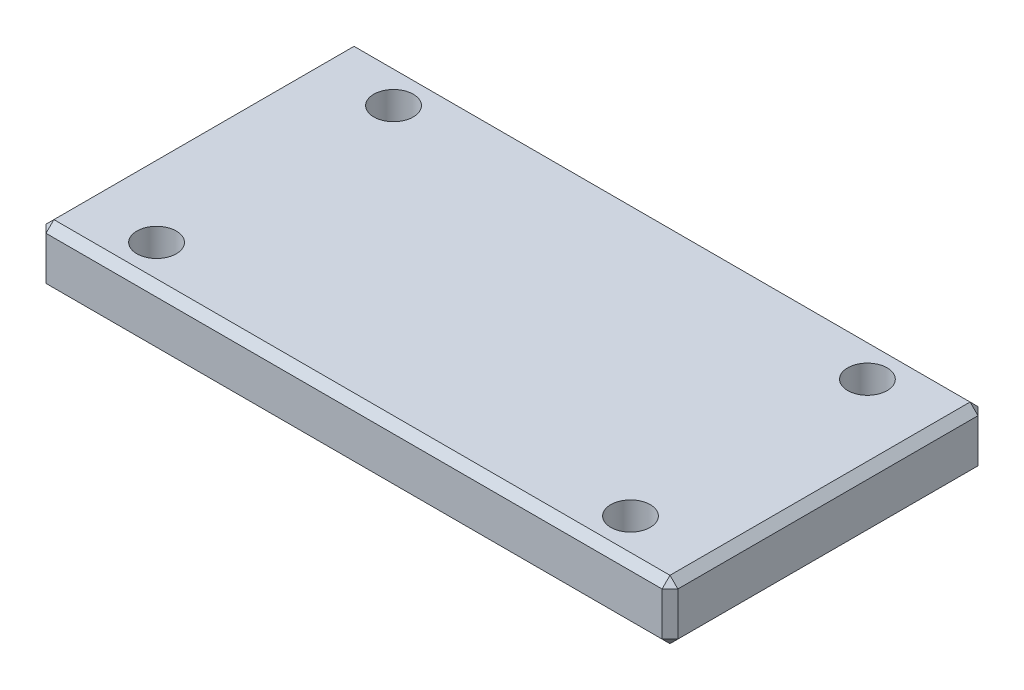
ISO-10303-21;
HEADER;
FILE_DESCRIPTION(('STEP AP214'),'2;1');
FILE_NAME('part.step','',(''),(''),'','','');
FILE_SCHEMA(('AUTOMOTIVE_DESIGN { 1 0 10303 214 1 1 1 1 }'));
ENDSEC;
DATA;
#1=APPLICATION_CONTEXT('core data for automotive mechanical design processes');
#2=APPLICATION_PROTOCOL_DEFINITION('international standard','automotive_design',2000,#1);
#3=PRODUCT_CONTEXT('',#1,'mechanical');
#4=PRODUCT('Part','Part','',(#3));
#5=PRODUCT_RELATED_PRODUCT_CATEGORY('part','',(#4));
#6=PRODUCT_DEFINITION_FORMATION('','',#4);
#7=PRODUCT_DEFINITION_CONTEXT('part definition',#1,'design');
#8=PRODUCT_DEFINITION('design','',#6,#7);
#9=PRODUCT_DEFINITION_SHAPE('','',#8);
#10=(LENGTH_UNIT() NAMED_UNIT(*) SI_UNIT(.MILLI.,.METRE.));
#11=(NAMED_UNIT(*) PLANE_ANGLE_UNIT() SI_UNIT($,.RADIAN.));
#12=(NAMED_UNIT(*) SI_UNIT($,.STERADIAN.) SOLID_ANGLE_UNIT());
#13=UNCERTAINTY_MEASURE_WITH_UNIT(LENGTH_MEASURE(1.E-05),#10,'distance_accuracy_value','');
#14=(GEOMETRIC_REPRESENTATION_CONTEXT(3) GLOBAL_UNCERTAINTY_ASSIGNED_CONTEXT((#13)) GLOBAL_UNIT_ASSIGNED_CONTEXT((#10,
#11,#12)) REPRESENTATION_CONTEXT('',''));
#15=CARTESIAN_POINT('',(0.,0.,0.));
#16=DIRECTION('',(0.,0.,1.));
#17=DIRECTION('',(1.,0.,0.));
#18=AXIS2_PLACEMENT_3D('',#15,#16,#17);
#19=CARTESIAN_POINT('',(-50.8,9.525,25.4));
#20=DIRECTION('',(1.,0.,0.));
#21=DIRECTION('',(0.,0.,-1.));
#22=AXIS2_PLACEMENT_3D('',#19,#20,#21);
#23=PLANE('',#22);
#24=DIRECTION('',(0.,-1.,0.));
#25=VECTOR('',#24,1.);
#26=CARTESIAN_POINT('',(-50.8,9.525,-24.13));
#27=LINE('',#26,#25);
#28=CARTESIAN_POINT('',(-50.8,8.25499999999998,-24.13));
#29=VERTEX_POINT('',#28);
#30=CARTESIAN_POINT('',(-50.8,1.27000000000002,-24.13));
#31=VERTEX_POINT('',#30);
#32=EDGE_CURVE('E196',#29,#31,#27,.T.);
#33=ORIENTED_EDGE('',*,*,#32,.T.);
#34=DIRECTION('',(0.,0.,1.));
#35=VECTOR('',#34,1.);
#36=CARTESIAN_POINT('',(-50.8,1.27000000000002,25.4));
#37=LINE('',#36,#35);
#38=CARTESIAN_POINT('',(-50.8,1.27000000000002,24.13));
#39=VERTEX_POINT('',#38);
#40=EDGE_CURVE('E198',#31,#39,#37,.T.);
#41=ORIENTED_EDGE('',*,*,#40,.T.);
#42=DIRECTION('',(0.,1.,0.));
#43=VECTOR('',#42,1.);
#44=CARTESIAN_POINT('',(-50.8,9.525,24.13));
#45=LINE('',#44,#43);
#46=CARTESIAN_POINT('',(-50.8,8.25499999999998,24.13));
#47=VERTEX_POINT('',#46);
#48=EDGE_CURVE('E192',#39,#47,#45,.T.);
#49=ORIENTED_EDGE('',*,*,#48,.T.);
#50=DIRECTION('',(0.,0.,-1.));
#51=VECTOR('',#50,1.);
#52=CARTESIAN_POINT('',(-50.8,8.25499999999998,-25.4));
#53=LINE('',#52,#51);
#54=EDGE_CURVE('E194',#47,#29,#53,.T.);
#55=ORIENTED_EDGE('',*,*,#54,.T.);
#56=EDGE_LOOP('',(#33,#41,#49,#55));
#57=FACE_BOUND('',#56,.T.);
#58=ADVANCED_FACE('F35',(#57),#23,.F.);
#59=CARTESIAN_POINT('',(50.8,9.525,25.4));
#60=DIRECTION('',(0.,0.,-1.));
#61=DIRECTION('',(-1.,0.,0.));
#62=AXIS2_PLACEMENT_3D('',#59,#60,#61);
#63=PLANE('',#62);
#64=DIRECTION('',(0.,-1.,0.));
#65=VECTOR('',#64,1.);
#66=CARTESIAN_POINT('',(-49.53,9.525,25.4));
#67=LINE('',#66,#65);
#68=CARTESIAN_POINT('',(-49.53,8.25499999999998,25.4));
#69=VERTEX_POINT('',#68);
#70=CARTESIAN_POINT('',(-49.53,1.27000000000002,25.4));
#71=VERTEX_POINT('',#70);
#72=EDGE_CURVE('E161',#69,#71,#67,.T.);
#73=ORIENTED_EDGE('',*,*,#72,.T.);
#74=DIRECTION('',(1.,0.,0.));
#75=VECTOR('',#74,1.);
#76=CARTESIAN_POINT('',(50.8,1.27000000000002,25.4));
#77=LINE('',#76,#75);
#78=CARTESIAN_POINT('',(49.53,1.27000000000002,25.4));
#79=VERTEX_POINT('',#78);
#80=EDGE_CURVE('E132',#71,#79,#77,.T.);
#81=ORIENTED_EDGE('',*,*,#80,.T.);
#82=DIRECTION('',(0.,1.,0.));
#83=VECTOR('',#82,1.);
#84=CARTESIAN_POINT('',(49.53,9.525,25.4));
#85=LINE('',#84,#83);
#86=CARTESIAN_POINT('',(49.53,8.25499999999998,25.4));
#87=VERTEX_POINT('',#86);
#88=EDGE_CURVE('E151',#79,#87,#85,.T.);
#89=ORIENTED_EDGE('',*,*,#88,.T.);
#90=DIRECTION('',(-1.,0.,0.));
#91=VECTOR('',#90,1.);
#92=CARTESIAN_POINT('',(-50.8,8.25499999999998,25.4));
#93=LINE('',#92,#91);
#94=EDGE_CURVE('E157',#87,#69,#93,.T.);
#95=ORIENTED_EDGE('',*,*,#94,.T.);
#96=EDGE_LOOP('',(#73,#81,#89,#95));
#97=FACE_BOUND('',#96,.T.);
#98=ADVANCED_FACE('F159',(#97),#63,.F.);
#99=CARTESIAN_POINT('',(50.8,9.525,25.4));
#100=DIRECTION('',(-1.,0.,0.));
#101=DIRECTION('',(0.,0.,1.));
#102=AXIS2_PLACEMENT_3D('',#99,#100,#101);
#103=PLANE('',#102);
#104=DIRECTION('',(0.,-1.,0.));
#105=VECTOR('',#104,1.);
#106=CARTESIAN_POINT('',(50.8,9.525,24.13));
#107=LINE('',#106,#105);
#108=CARTESIAN_POINT('',(50.8,8.25499999999998,24.13));
#109=VERTEX_POINT('',#108);
#110=CARTESIAN_POINT('',(50.8,1.27000000000002,24.13));
#111=VERTEX_POINT('',#110);
#112=EDGE_CURVE('E174',#109,#111,#107,.T.);
#113=ORIENTED_EDGE('',*,*,#112,.T.);
#114=DIRECTION('',(0.,0.,-1.));
#115=VECTOR('',#114,1.);
#116=CARTESIAN_POINT('',(50.8,1.27000000000002,25.4));
#117=LINE('',#116,#115);
#118=CARTESIAN_POINT('',(50.8,1.27000000000002,-24.13));
#119=VERTEX_POINT('',#118);
#120=EDGE_CURVE('E180',#111,#119,#117,.T.);
#121=ORIENTED_EDGE('',*,*,#120,.T.);
#122=DIRECTION('',(0.,1.,0.));
#123=VECTOR('',#122,1.);
#124=CARTESIAN_POINT('',(50.8,9.525,-24.13));
#125=LINE('',#124,#123);
#126=CARTESIAN_POINT('',(50.8,8.25499999999998,-24.13));
#127=VERTEX_POINT('',#126);
#128=EDGE_CURVE('E178',#119,#127,#125,.T.);
#129=ORIENTED_EDGE('',*,*,#128,.T.);
#130=DIRECTION('',(0.,0.,1.));
#131=VECTOR('',#130,1.);
#132=CARTESIAN_POINT('',(50.8,8.25499999999998,25.4));
#133=LINE('',#132,#131);
#134=EDGE_CURVE('E176',#127,#109,#133,.T.);
#135=ORIENTED_EDGE('',*,*,#134,.T.);
#136=EDGE_LOOP('',(#113,#121,#129,#135));
#137=FACE_BOUND('',#136,.T.);
#138=ADVANCED_FACE('F295',(#137),#103,.F.);
#139=CARTESIAN_POINT('',(50.8,9.525,-25.4));
#140=DIRECTION('',(0.,0.,1.));
#141=DIRECTION('',(1.,0.,0.));
#142=AXIS2_PLACEMENT_3D('',#139,#140,#141);
#143=PLANE('',#142);
#144=DIRECTION('',(1.,0.,0.));
#145=VECTOR('',#144,1.);
#146=CARTESIAN_POINT('',(50.8,8.25499999999998,-25.4));
#147=LINE('',#146,#145);
#148=CARTESIAN_POINT('',(-49.53,8.25499999999998,-25.4));
#149=VERTEX_POINT('',#148);
#150=CARTESIAN_POINT('',(49.53,8.25499999999998,-25.4));
#151=VERTEX_POINT('',#150);
#152=EDGE_CURVE('E185',#149,#151,#147,.T.);
#153=ORIENTED_EDGE('',*,*,#152,.T.);
#154=DIRECTION('',(0.,-1.,0.));
#155=VECTOR('',#154,1.);
#156=CARTESIAN_POINT('',(49.53,9.525,-25.4));
#157=LINE('',#156,#155);
#158=CARTESIAN_POINT('',(49.53,1.27000000000002,-25.4));
#159=VERTEX_POINT('',#158);
#160=EDGE_CURVE('E190',#151,#159,#157,.T.);
#161=ORIENTED_EDGE('',*,*,#160,.T.);
#162=DIRECTION('',(-1.,0.,0.));
#163=VECTOR('',#162,1.);
#164=CARTESIAN_POINT('',(50.8,1.27000000000002,-25.4));
#165=LINE('',#164,#163);
#166=CARTESIAN_POINT('',(-49.53,1.27000000000002,-25.4));
#167=VERTEX_POINT('',#166);
#168=EDGE_CURVE('E187',#159,#167,#165,.T.);
#169=ORIENTED_EDGE('',*,*,#168,.T.);
#170=DIRECTION('',(0.,1.,0.));
#171=VECTOR('',#170,1.);
#172=CARTESIAN_POINT('',(-49.53,9.525,-25.4));
#173=LINE('',#172,#171);
#174=EDGE_CURVE('E183',#167,#149,#173,.T.);
#175=ORIENTED_EDGE('',*,*,#174,.T.);
#176=EDGE_LOOP('',(#153,#161,#169,#175));
#177=FACE_BOUND('',#176,.T.);
#178=ADVANCED_FACE('F422',(#177),#143,.F.);
#179=CARTESIAN_POINT('',(0.,9.525,0.));
#180=DIRECTION('',(0.,1.,0.));
#181=DIRECTION('',(0.,0.,1.));
#182=AXIS2_PLACEMENT_3D('',#179,#180,#181);
#183=PLANE('',#182);
#184=CARTESIAN_POINT('',(38.1,9.525,-19.05));
#185=DIRECTION('',(0.,1.,0.));
#186=DIRECTION('',(0.,0.,-1.));
#187=AXIS2_PLACEMENT_3D('',#184,#185,#186);
#188=CIRCLE('',#187,3.175);
#189=CARTESIAN_POINT('',(38.1,9.525,-15.875));
#190=VERTEX_POINT('',#189);
#191=EDGE_CURVE('E455',#190,#190,#188,.T.);
#192=ORIENTED_EDGE('',*,*,#191,.F.);
#193=EDGE_LOOP('',(#192));
#194=FACE_BOUND('',#193,.T.);
#195=CARTESIAN_POINT('',(38.1,9.525,19.05));
#196=DIRECTION('',(0.,1.,0.));
#197=DIRECTION('',(0.,0.,1.));
#198=AXIS2_PLACEMENT_3D('',#195,#196,#197);
#199=CIRCLE('',#198,3.175);
#200=CARTESIAN_POINT('',(38.1,9.525,22.225));
#201=VERTEX_POINT('',#200);
#202=EDGE_CURVE('E460',#201,#201,#199,.T.);
#203=ORIENTED_EDGE('',*,*,#202,.F.);
#204=EDGE_LOOP('',(#203));
#205=FACE_BOUND('',#204,.T.);
#206=CARTESIAN_POINT('',(-38.1,9.525,19.05));
#207=DIRECTION('',(0.,1.,0.));
#208=DIRECTION('',(0.,0.,-1.));
#209=AXIS2_PLACEMENT_3D('',#206,#207,#208);
#210=CIRCLE('',#209,3.175);
#211=CARTESIAN_POINT('',(-38.1,9.525,22.225));
#212=VERTEX_POINT('',#211);
#213=EDGE_CURVE('E466',#212,#212,#210,.T.);
#214=ORIENTED_EDGE('',*,*,#213,.F.);
#215=EDGE_LOOP('',(#214));
#216=FACE_BOUND('',#215,.T.);
#217=CARTESIAN_POINT('',(-38.1,9.525,-19.05));
#218=DIRECTION('',(0.,1.,0.));
#219=DIRECTION('',(0.,0.,1.));
#220=AXIS2_PLACEMENT_3D('',#217,#218,#219);
#221=CIRCLE('',#220,3.175);
#222=CARTESIAN_POINT('',(-38.1,9.525,-15.875));
#223=VERTEX_POINT('',#222);
#224=EDGE_CURVE('E449',#223,#223,#221,.T.);
#225=ORIENTED_EDGE('',*,*,#224,.F.);
#226=EDGE_LOOP('',(#225));
#227=FACE_BOUND('',#226,.T.);
#228=DIRECTION('',(0.,0.,-1.));
#229=VECTOR('',#228,1.);
#230=CARTESIAN_POINT('',(49.53,9.525,-25.4));
#231=LINE('',#230,#229);
#232=CARTESIAN_POINT('',(49.53,9.525,24.13));
#233=VERTEX_POINT('',#232);
#234=CARTESIAN_POINT('',(49.53,9.525,-24.13));
#235=VERTEX_POINT('',#234);
#236=EDGE_CURVE('E45',#233,#235,#231,.T.);
#237=ORIENTED_EDGE('',*,*,#236,.T.);
#238=DIRECTION('',(-1.,0.,0.));
#239=VECTOR('',#238,1.);
#240=CARTESIAN_POINT('',(-50.8,9.525,-24.13));
#241=LINE('',#240,#239);
#242=CARTESIAN_POINT('',(-49.53,9.525,-24.13));
#243=VERTEX_POINT('',#242);
#244=EDGE_CURVE('E11',#235,#243,#241,.T.);
#245=ORIENTED_EDGE('',*,*,#244,.T.);
#246=DIRECTION('',(0.,0.,1.));
#247=VECTOR('',#246,1.);
#248=CARTESIAN_POINT('',(-49.53,9.525,25.4));
#249=LINE('',#248,#247);
#250=CARTESIAN_POINT('',(-49.53,9.525,24.13));
#251=VERTEX_POINT('',#250);
#252=EDGE_CURVE('E59',#243,#251,#249,.T.);
#253=ORIENTED_EDGE('',*,*,#252,.T.);
#254=DIRECTION('',(1.,0.,0.));
#255=VECTOR('',#254,1.);
#256=CARTESIAN_POINT('',(50.8,9.525,24.13));
#257=LINE('',#256,#255);
#258=EDGE_CURVE('E201',#251,#233,#257,.T.);
#259=ORIENTED_EDGE('',*,*,#258,.T.);
#260=EDGE_LOOP('',(#237,#245,#253,#259));
#261=FACE_BOUND('',#260,.T.);
#262=ADVANCED_FACE('F416',(#194,#205,#216,#227,#261),#183,.T.);
#263=CARTESIAN_POINT('',(0.,0.,0.));
#264=DIRECTION('',(0.,1.,0.));
#265=DIRECTION('',(0.,0.,1.));
#266=AXIS2_PLACEMENT_3D('',#263,#264,#265);
#267=PLANE('',#266);
#268=CARTESIAN_POINT('',(38.1,0.,-19.05));
#269=DIRECTION('',(0.,1.,0.));
#270=DIRECTION('',(0.,0.,-1.));
#271=AXIS2_PLACEMENT_3D('',#268,#269,#270);
#272=CIRCLE('',#271,3.175);
#273=CARTESIAN_POINT('',(38.1,0.,-15.875));
#274=VERTEX_POINT('',#273);
#275=EDGE_CURVE('E458',#274,#274,#272,.T.);
#276=ORIENTED_EDGE('',*,*,#275,.T.);
#277=EDGE_LOOP('',(#276));
#278=FACE_BOUND('',#277,.T.);
#279=CARTESIAN_POINT('',(38.1,0.,19.05));
#280=DIRECTION('',(0.,1.,0.));
#281=DIRECTION('',(0.,0.,1.));
#282=AXIS2_PLACEMENT_3D('',#279,#280,#281);
#283=CIRCLE('',#282,3.175);
#284=CARTESIAN_POINT('',(38.1,0.,22.225));
#285=VERTEX_POINT('',#284);
#286=EDGE_CURVE('E463',#285,#285,#283,.T.);
#287=ORIENTED_EDGE('',*,*,#286,.T.);
#288=EDGE_LOOP('',(#287));
#289=FACE_BOUND('',#288,.T.);
#290=CARTESIAN_POINT('',(-38.1,0.,19.05));
#291=DIRECTION('',(0.,1.,0.));
#292=DIRECTION('',(0.,0.,-1.));
#293=AXIS2_PLACEMENT_3D('',#290,#291,#292);
#294=CIRCLE('',#293,3.175);
#295=CARTESIAN_POINT('',(-38.1,0.,22.225));
#296=VERTEX_POINT('',#295);
#297=EDGE_CURVE('E452',#296,#296,#294,.T.);
#298=ORIENTED_EDGE('',*,*,#297,.T.);
#299=EDGE_LOOP('',(#298));
#300=FACE_BOUND('',#299,.T.);
#301=CARTESIAN_POINT('',(-38.1,0.,-19.05));
#302=DIRECTION('',(0.,1.,0.));
#303=DIRECTION('',(0.,0.,1.));
#304=AXIS2_PLACEMENT_3D('',#301,#302,#303);
#305=CIRCLE('',#304,3.175);
#306=CARTESIAN_POINT('',(-38.1,0.,-15.875));
#307=VERTEX_POINT('',#306);
#308=EDGE_CURVE('E138',#307,#307,#305,.T.);
#309=ORIENTED_EDGE('',*,*,#308,.T.);
#310=EDGE_LOOP('',(#309));
#311=FACE_BOUND('',#310,.T.);
#312=DIRECTION('',(0.,0.,1.));
#313=VECTOR('',#312,1.);
#314=CARTESIAN_POINT('',(49.53,0.,0.));
#315=LINE('',#314,#313);
#316=CARTESIAN_POINT('',(49.53,0.,-24.13));
#317=VERTEX_POINT('',#316);
#318=CARTESIAN_POINT('',(49.53,0.,24.13));
#319=VERTEX_POINT('',#318);
#320=EDGE_CURVE('E171',#317,#319,#315,.T.);
#321=ORIENTED_EDGE('',*,*,#320,.T.);
#322=DIRECTION('',(-1.,0.,0.));
#323=VECTOR('',#322,1.);
#324=CARTESIAN_POINT('',(0.,0.,24.13));
#325=LINE('',#324,#323);
#326=CARTESIAN_POINT('',(-49.53,0.,24.13));
#327=VERTEX_POINT('',#326);
#328=EDGE_CURVE('E134',#319,#327,#325,.T.);
#329=ORIENTED_EDGE('',*,*,#328,.T.);
#330=DIRECTION('',(0.,0.,-1.));
#331=VECTOR('',#330,1.);
#332=CARTESIAN_POINT('',(-49.53,0.,0.));
#333=LINE('',#332,#331);
#334=CARTESIAN_POINT('',(-49.53,0.,-24.13));
#335=VERTEX_POINT('',#334);
#336=EDGE_CURVE('E163',#327,#335,#333,.T.);
#337=ORIENTED_EDGE('',*,*,#336,.T.);
#338=DIRECTION('',(1.,0.,0.));
#339=VECTOR('',#338,1.);
#340=CARTESIAN_POINT('',(0.,0.,-24.13));
#341=LINE('',#340,#339);
#342=EDGE_CURVE('E165',#335,#317,#341,.T.);
#343=ORIENTED_EDGE('',*,*,#342,.T.);
#344=EDGE_LOOP('',(#321,#329,#337,#343));
#345=FACE_BOUND('',#344,.T.);
#346=ADVANCED_FACE('F412',(#278,#289,#300,#311,#345),#267,.F.);
#347=CARTESIAN_POINT('',(0.,9.525,-24.13));
#348=DIRECTION('',(0.,0.707106781186546,-0.707106781186549));
#349=DIRECTION('',(1.,0.,0.));
#350=AXIS2_PLACEMENT_3D('',#347,#348,#349);
#351=PLANE('',#350);
#352=DIRECTION('',(0.,-0.707106781186549,-0.707106781186546));
#353=VECTOR('',#352,1.);
#354=CARTESIAN_POINT('',(-49.53,9.525,-24.13));
#355=LINE('',#354,#353);
#356=EDGE_CURVE('E40',#243,#149,#355,.T.);
#357=ORIENTED_EDGE('',*,*,#356,.F.);
#358=ORIENTED_EDGE('',*,*,#244,.F.);
#359=DIRECTION('',(0.,0.707106781186549,0.707106781186546));
#360=VECTOR('',#359,1.);
#361=CARTESIAN_POINT('',(49.53,8.25499999999998,-25.4));
#362=LINE('',#361,#360);
#363=EDGE_CURVE('E253',#151,#235,#362,.T.);
#364=ORIENTED_EDGE('',*,*,#363,.F.);
#365=ORIENTED_EDGE('',*,*,#152,.F.);
#366=EDGE_LOOP('',(#357,#358,#364,#365));
#367=FACE_BOUND('',#366,.T.);
#368=ADVANCED_FACE('F38',(#367),#351,.T.);
#369=CARTESIAN_POINT('',(-49.53,9.525,-24.13));
#370=DIRECTION('',(-0.577350269189626,0.577350269189625,-0.577350269189626));
#371=DIRECTION('',(-0.707106781186547,0.,0.707106781186547));
#372=AXIS2_PLACEMENT_3D('',#369,#370,#371);
#373=PLANE('',#372);
#374=DIRECTION('',(0.707106781186548,0.707106781186548,0.));
#375=VECTOR('',#374,1.);
#376=CARTESIAN_POINT('',(-49.53,9.525,-24.13));
#377=LINE('',#376,#375);
#378=EDGE_CURVE('E249',#243,#29,#377,.F.);
#379=ORIENTED_EDGE('',*,*,#378,.F.);
#380=ORIENTED_EDGE('',*,*,#356,.T.);
#381=DIRECTION('',(0.707106781186548,0.,-0.707106781186548));
#382=VECTOR('',#381,1.);
#383=CARTESIAN_POINT('',(-50.165,8.25499999999998,-24.765));
#384=LINE('',#383,#382);
#385=EDGE_CURVE('E251',#29,#149,#384,.T.);
#386=ORIENTED_EDGE('',*,*,#385,.F.);
#387=EDGE_LOOP('',(#379,#380,#386));
#388=FACE_BOUND('',#387,.T.);
#389=ADVANCED_FACE('F263',(#388),#373,.T.);
#390=CARTESIAN_POINT('',(49.53,8.25499999999998,-25.4));
#391=DIRECTION('',(0.577350269189626,0.577350269189625,-0.577350269189626));
#392=DIRECTION('',(-0.707106781186547,0.,-0.707106781186547));
#393=AXIS2_PLACEMENT_3D('',#390,#391,#392);
#394=PLANE('',#393);
#395=DIRECTION('',(0.707106781186548,0.,0.707106781186548));
#396=VECTOR('',#395,1.);
#397=CARTESIAN_POINT('',(49.53,8.25499999999998,-25.4));
#398=LINE('',#397,#396);
#399=EDGE_CURVE('E243',#151,#127,#398,.T.);
#400=ORIENTED_EDGE('',*,*,#399,.F.);
#401=ORIENTED_EDGE('',*,*,#363,.T.);
#402=DIRECTION('',(0.707106781186548,-0.707106781186548,0.));
#403=VECTOR('',#402,1.);
#404=CARTESIAN_POINT('',(50.165,8.88999999999999,-24.13));
#405=LINE('',#404,#403);
#406=EDGE_CURVE('E246',#127,#235,#405,.F.);
#407=ORIENTED_EDGE('',*,*,#406,.F.);
#408=EDGE_LOOP('',(#400,#401,#407));
#409=FACE_BOUND('',#408,.T.);
#410=ADVANCED_FACE('F287',(#409),#394,.T.);
#411=CARTESIAN_POINT('',(-50.8,9.525,-24.13));
#412=DIRECTION('',(0.707106781186548,0.,0.707106781186548));
#413=DIRECTION('',(0.,-1.,0.));
#414=AXIS2_PLACEMENT_3D('',#411,#412,#413);
#415=PLANE('',#414);
#416=ORIENTED_EDGE('',*,*,#385,.T.);
#417=ORIENTED_EDGE('',*,*,#174,.F.);
#418=DIRECTION('',(-0.707106781186548,0.,0.707106781186548));
#419=VECTOR('',#418,1.);
#420=CARTESIAN_POINT('',(-49.53,1.27000000000002,-25.4));
#421=LINE('',#420,#419);
#422=EDGE_CURVE('E238',#31,#167,#421,.F.);
#423=ORIENTED_EDGE('',*,*,#422,.F.);
#424=ORIENTED_EDGE('',*,*,#32,.F.);
#425=EDGE_LOOP('',(#416,#417,#423,#424));
#426=FACE_BOUND('',#425,.T.);
#427=ADVANCED_FACE('F269',(#426),#415,.F.);
#428=CARTESIAN_POINT('',(-49.53,9.525,0.));
#429=DIRECTION('',(-0.707106781186548,0.707106781186548,0.));
#430=DIRECTION('',(0.,0.,-1.));
#431=AXIS2_PLACEMENT_3D('',#428,#429,#430);
#432=PLANE('',#431);
#433=ORIENTED_EDGE('',*,*,#378,.T.);
#434=ORIENTED_EDGE('',*,*,#54,.F.);
#435=DIRECTION('',(-0.707106781186548,-0.707106781186548,0.));
#436=VECTOR('',#435,1.);
#437=CARTESIAN_POINT('',(-49.53,9.525,24.13));
#438=LINE('',#437,#436);
#439=EDGE_CURVE('E235',#251,#47,#438,.T.);
#440=ORIENTED_EDGE('',*,*,#439,.F.);
#441=ORIENTED_EDGE('',*,*,#252,.F.);
#442=EDGE_LOOP('',(#433,#434,#440,#441));
#443=FACE_BOUND('',#442,.T.);
#444=ADVANCED_FACE('F276',(#443),#432,.T.);
#445=CARTESIAN_POINT('',(0.,9.525,24.13));
#446=DIRECTION('',(0.,0.707106781186548,0.707106781186547));
#447=DIRECTION('',(-1.,0.,0.));
#448=AXIS2_PLACEMENT_3D('',#445,#446,#447);
#449=PLANE('',#448);
#450=DIRECTION('',(0.,-0.707106781186547,0.707106781186548));
#451=VECTOR('',#450,1.);
#452=CARTESIAN_POINT('',(49.53,8.88999999999999,24.765));
#453=LINE('',#452,#451);
#454=EDGE_CURVE('E229',#233,#87,#453,.T.);
#455=ORIENTED_EDGE('',*,*,#454,.F.);
#456=ORIENTED_EDGE('',*,*,#258,.F.);
#457=DIRECTION('',(0.,0.707106781186547,-0.707106781186548));
#458=VECTOR('',#457,1.);
#459=CARTESIAN_POINT('',(-49.53,9.525,24.13));
#460=LINE('',#459,#458);
#461=EDGE_CURVE('E232',#69,#251,#460,.T.);
#462=ORIENTED_EDGE('',*,*,#461,.F.);
#463=ORIENTED_EDGE('',*,*,#94,.F.);
#464=EDGE_LOOP('',(#455,#456,#462,#463));
#465=FACE_BOUND('',#464,.T.);
#466=ADVANCED_FACE('F278',(#465),#449,.T.);
#467=CARTESIAN_POINT('',(49.53,9.525,0.));
#468=DIRECTION('',(0.707106781186548,0.707106781186548,0.));
#469=DIRECTION('',(0.,0.,1.));
#470=AXIS2_PLACEMENT_3D('',#467,#468,#469);
#471=PLANE('',#470);
#472=ORIENTED_EDGE('',*,*,#406,.T.);
#473=ORIENTED_EDGE('',*,*,#236,.F.);
#474=DIRECTION('',(-0.707106781186548,0.707106781186548,0.));
#475=VECTOR('',#474,1.);
#476=CARTESIAN_POINT('',(50.8,8.25499999999998,24.13));
#477=LINE('',#476,#475);
#478=EDGE_CURVE('E226',#109,#233,#477,.T.);
#479=ORIENTED_EDGE('',*,*,#478,.F.);
#480=ORIENTED_EDGE('',*,*,#134,.F.);
#481=EDGE_LOOP('',(#472,#473,#479,#480));
#482=FACE_BOUND('',#481,.T.);
#483=ADVANCED_FACE('F284',(#482),#471,.T.);
#484=CARTESIAN_POINT('',(49.53,9.525,-25.4));
#485=DIRECTION('',(-0.707106781186548,0.,0.707106781186548));
#486=DIRECTION('',(0.,-1.,0.));
#487=AXIS2_PLACEMENT_3D('',#484,#485,#486);
#488=PLANE('',#487);
#489=ORIENTED_EDGE('',*,*,#399,.T.);
#490=ORIENTED_EDGE('',*,*,#128,.F.);
#491=DIRECTION('',(-0.707106781186548,0.,-0.707106781186548));
#492=VECTOR('',#491,1.);
#493=CARTESIAN_POINT('',(50.8,1.27000000000002,-24.13));
#494=LINE('',#493,#492);
#495=EDGE_CURVE('E223',#159,#119,#494,.F.);
#496=ORIENTED_EDGE('',*,*,#495,.F.);
#497=ORIENTED_EDGE('',*,*,#160,.F.);
#498=EDGE_LOOP('',(#489,#490,#496,#497));
#499=FACE_BOUND('',#498,.T.);
#500=ADVANCED_FACE('F378',(#499),#488,.F.);
#501=CARTESIAN_POINT('',(50.8,1.27000000000002,-25.4));
#502=DIRECTION('',(0.,0.707106781186546,0.707106781186549));
#503=DIRECTION('',(-1.,0.,0.));
#504=AXIS2_PLACEMENT_3D('',#501,#502,#503);
#505=PLANE('',#504);
#506=DIRECTION('',(0.,0.707106781186549,-0.707106781186546));
#507=VECTOR('',#506,1.);
#508=CARTESIAN_POINT('',(-49.53,1.27000000000002,-25.4));
#509=LINE('',#508,#507);
#510=EDGE_CURVE('E240',#167,#335,#509,.F.);
#511=ORIENTED_EDGE('',*,*,#510,.F.);
#512=ORIENTED_EDGE('',*,*,#168,.F.);
#513=DIRECTION('',(0.,-0.707106781186549,0.707106781186546));
#514=VECTOR('',#513,1.);
#515=CARTESIAN_POINT('',(49.53,0.635000000000011,-24.765));
#516=LINE('',#515,#514);
#517=EDGE_CURVE('E220',#317,#159,#516,.F.);
#518=ORIENTED_EDGE('',*,*,#517,.F.);
#519=ORIENTED_EDGE('',*,*,#342,.F.);
#520=EDGE_LOOP('',(#511,#512,#518,#519));
#521=FACE_BOUND('',#520,.T.);
#522=ADVANCED_FACE('F371',(#521),#505,.F.);
#523=CARTESIAN_POINT('',(-49.53,1.27000000000002,-25.4));
#524=DIRECTION('',(-0.577350269189626,-0.577350269189625,-0.577350269189626));
#525=DIRECTION('',(-0.707106781186547,0.,0.707106781186547));
#526=AXIS2_PLACEMENT_3D('',#523,#524,#525);
#527=PLANE('',#526);
#528=ORIENTED_EDGE('',*,*,#422,.T.);
#529=ORIENTED_EDGE('',*,*,#510,.T.);
#530=DIRECTION('',(0.707106781186548,-0.707106781186548,0.));
#531=VECTOR('',#530,1.);
#532=CARTESIAN_POINT('',(-50.165,0.635000000000009,-24.13));
#533=LINE('',#532,#531);
#534=EDGE_CURVE('E217',#31,#335,#533,.T.);
#535=ORIENTED_EDGE('',*,*,#534,.F.);
#536=EDGE_LOOP('',(#528,#529,#535));
#537=FACE_BOUND('',#536,.T.);
#538=ADVANCED_FACE('F364',(#537),#527,.T.);
#539=CARTESIAN_POINT('',(-49.53,9.525,24.13));
#540=DIRECTION('',(-0.577350269189625,0.577350269189627,0.577350269189625));
#541=DIRECTION('',(0.,-0.707106781186546,0.707106781186549));
#542=AXIS2_PLACEMENT_3D('',#539,#540,#541);
#543=PLANE('',#542);
#544=ORIENTED_EDGE('',*,*,#461,.T.);
#545=ORIENTED_EDGE('',*,*,#439,.T.);
#546=DIRECTION('',(-0.707106781186548,0.,-0.707106781186548));
#547=VECTOR('',#546,1.);
#548=CARTESIAN_POINT('',(-50.165,8.25499999999998,24.765));
#549=LINE('',#548,#547);
#550=EDGE_CURVE('E214',#69,#47,#549,.T.);
#551=ORIENTED_EDGE('',*,*,#550,.F.);
#552=EDGE_LOOP('',(#544,#545,#551));
#553=FACE_BOUND('',#552,.T.);
#554=ADVANCED_FACE('F357',(#553),#543,.T.);
#555=CARTESIAN_POINT('',(50.8,8.25499999999998,24.13));
#556=DIRECTION('',(0.577350269189625,0.577350269189627,0.577350269189625));
#557=DIRECTION('',(0.,-0.707106781186546,0.707106781186549));
#558=AXIS2_PLACEMENT_3D('',#555,#556,#557);
#559=PLANE('',#558);
#560=ORIENTED_EDGE('',*,*,#478,.T.);
#561=ORIENTED_EDGE('',*,*,#454,.T.);
#562=DIRECTION('',(-0.707106781186548,0.,0.707106781186548));
#563=VECTOR('',#562,1.);
#564=CARTESIAN_POINT('',(50.8,8.25499999999998,24.13));
#565=LINE('',#564,#563);
#566=EDGE_CURVE('E154',#109,#87,#565,.T.);
#567=ORIENTED_EDGE('',*,*,#566,.F.);
#568=EDGE_LOOP('',(#560,#561,#567));
#569=FACE_BOUND('',#568,.T.);
#570=ADVANCED_FACE('F350',(#569),#559,.T.);
#571=CARTESIAN_POINT('',(50.8,1.27000000000002,-24.13));
#572=DIRECTION('',(0.577350269189626,-0.577350269189625,-0.577350269189626));
#573=DIRECTION('',(-0.707106781186547,0.,-0.707106781186547));
#574=AXIS2_PLACEMENT_3D('',#571,#572,#573);
#575=PLANE('',#574);
#576=ORIENTED_EDGE('',*,*,#517,.T.);
#577=ORIENTED_EDGE('',*,*,#495,.T.);
#578=DIRECTION('',(0.707106781186548,0.707106781186548,0.));
#579=VECTOR('',#578,1.);
#580=CARTESIAN_POINT('',(50.8,1.27000000000002,-24.13));
#581=LINE('',#580,#579);
#582=EDGE_CURVE('E211',#317,#119,#581,.T.);
#583=ORIENTED_EDGE('',*,*,#582,.F.);
#584=EDGE_LOOP('',(#576,#577,#583));
#585=FACE_BOUND('',#584,.T.);
#586=ADVANCED_FACE('F343',(#585),#575,.T.);
#587=CARTESIAN_POINT('',(-50.8,1.27000000000002,25.4));
#588=DIRECTION('',(0.707106781186548,0.707106781186548,0.));
#589=DIRECTION('',(0.,0.,1.));
#590=AXIS2_PLACEMENT_3D('',#587,#588,#589);
#591=PLANE('',#590);
#592=ORIENTED_EDGE('',*,*,#534,.T.);
#593=ORIENTED_EDGE('',*,*,#336,.F.);
#594=DIRECTION('',(-0.707106781186548,0.707106781186548,0.));
#595=VECTOR('',#594,1.);
#596=CARTESIAN_POINT('',(-49.53,0.,24.13));
#597=LINE('',#596,#595);
#598=EDGE_CURVE('E208',#39,#327,#597,.F.);
#599=ORIENTED_EDGE('',*,*,#598,.F.);
#600=ORIENTED_EDGE('',*,*,#40,.F.);
#601=EDGE_LOOP('',(#592,#593,#599,#600));
#602=FACE_BOUND('',#601,.T.);
#603=ADVANCED_FACE('F336',(#602),#591,.F.);
#604=CARTESIAN_POINT('',(-49.53,9.525,25.4));
#605=DIRECTION('',(0.707106781186548,0.,-0.707106781186548));
#606=DIRECTION('',(0.,-1.,0.));
#607=AXIS2_PLACEMENT_3D('',#604,#605,#606);
#608=PLANE('',#607);
#609=ORIENTED_EDGE('',*,*,#550,.T.);
#610=ORIENTED_EDGE('',*,*,#48,.F.);
#611=DIRECTION('',(0.707106781186548,0.,0.707106781186548));
#612=VECTOR('',#611,1.);
#613=CARTESIAN_POINT('',(-50.165,1.27000000000002,24.765));
#614=LINE('',#613,#612);
#615=EDGE_CURVE('E148',#71,#39,#614,.F.);
#616=ORIENTED_EDGE('',*,*,#615,.F.);
#617=ORIENTED_EDGE('',*,*,#72,.F.);
#618=EDGE_LOOP('',(#609,#610,#616,#617));
#619=FACE_BOUND('',#618,.T.);
#620=ADVANCED_FACE('F330',(#619),#608,.F.);
#621=CARTESIAN_POINT('',(50.8,9.525,24.13));
#622=DIRECTION('',(-0.707106781186548,0.,-0.707106781186548));
#623=DIRECTION('',(0.,-1.,0.));
#624=AXIS2_PLACEMENT_3D('',#621,#622,#623);
#625=PLANE('',#624);
#626=ORIENTED_EDGE('',*,*,#566,.T.);
#627=ORIENTED_EDGE('',*,*,#88,.F.);
#628=DIRECTION('',(0.707106781186548,0.,-0.707106781186548));
#629=VECTOR('',#628,1.);
#630=CARTESIAN_POINT('',(49.53,1.27000000000002,25.4));
#631=LINE('',#630,#629);
#632=EDGE_CURVE('E141',#111,#79,#631,.F.);
#633=ORIENTED_EDGE('',*,*,#632,.F.);
#634=ORIENTED_EDGE('',*,*,#112,.F.);
#635=EDGE_LOOP('',(#626,#627,#633,#634));
#636=FACE_BOUND('',#635,.T.);
#637=ADVANCED_FACE('F152',(#636),#625,.F.);
#638=CARTESIAN_POINT('',(50.8,1.27000000000002,25.4));
#639=DIRECTION('',(-0.707106781186548,0.707106781186548,0.));
#640=DIRECTION('',(0.,0.,-1.));
#641=AXIS2_PLACEMENT_3D('',#638,#639,#640);
#642=PLANE('',#641);
#643=ORIENTED_EDGE('',*,*,#582,.T.);
#644=ORIENTED_EDGE('',*,*,#120,.F.);
#645=DIRECTION('',(-0.707106781186548,-0.707106781186548,0.));
#646=VECTOR('',#645,1.);
#647=CARTESIAN_POINT('',(50.165,0.635000000000012,24.13));
#648=LINE('',#647,#646);
#649=EDGE_CURVE('E145',#319,#111,#648,.F.);
#650=ORIENTED_EDGE('',*,*,#649,.F.);
#651=ORIENTED_EDGE('',*,*,#320,.F.);
#652=EDGE_LOOP('',(#643,#644,#650,#651));
#653=FACE_BOUND('',#652,.T.);
#654=ADVANCED_FACE('F317',(#653),#642,.F.);
#655=CARTESIAN_POINT('',(-49.53,0.,24.13));
#656=DIRECTION('',(-0.577350269189625,-0.577350269189627,0.577350269189625));
#657=DIRECTION('',(0.,-0.707106781186546,-0.707106781186549));
#658=AXIS2_PLACEMENT_3D('',#655,#656,#657);
#659=PLANE('',#658);
#660=ORIENTED_EDGE('',*,*,#615,.T.);
#661=ORIENTED_EDGE('',*,*,#598,.T.);
#662=DIRECTION('',(0.,-0.707106781186547,-0.707106781186548));
#663=VECTOR('',#662,1.);
#664=CARTESIAN_POINT('',(-49.53,0.,24.13));
#665=LINE('',#664,#663);
#666=EDGE_CURVE('E137',#71,#327,#665,.T.);
#667=ORIENTED_EDGE('',*,*,#666,.F.);
#668=EDGE_LOOP('',(#660,#661,#667));
#669=FACE_BOUND('',#668,.T.);
#670=ADVANCED_FACE('F311',(#669),#659,.T.);
#671=CARTESIAN_POINT('',(49.53,1.27000000000002,25.4));
#672=DIRECTION('',(0.577350269189625,-0.577350269189627,0.577350269189625));
#673=DIRECTION('',(0.,-0.707106781186546,-0.707106781186549));
#674=AXIS2_PLACEMENT_3D('',#671,#672,#673);
#675=PLANE('',#674);
#676=ORIENTED_EDGE('',*,*,#649,.T.);
#677=ORIENTED_EDGE('',*,*,#632,.T.);
#678=DIRECTION('',(0.,0.707106781186547,0.707106781186548));
#679=VECTOR('',#678,1.);
#680=CARTESIAN_POINT('',(49.53,1.27000000000002,25.4));
#681=LINE('',#680,#679);
#682=EDGE_CURVE('E128',#319,#79,#681,.T.);
#683=ORIENTED_EDGE('',*,*,#682,.F.);
#684=EDGE_LOOP('',(#676,#677,#683));
#685=FACE_BOUND('',#684,.T.);
#686=ADVANCED_FACE('F143',(#685),#675,.T.);
#687=CARTESIAN_POINT('',(50.8,1.27000000000002,25.4));
#688=DIRECTION('',(0.,0.707106781186548,-0.707106781186547));
#689=DIRECTION('',(1.,0.,0.));
#690=AXIS2_PLACEMENT_3D('',#687,#688,#689);
#691=PLANE('',#690);
#692=ORIENTED_EDGE('',*,*,#666,.T.);
#693=ORIENTED_EDGE('',*,*,#328,.F.);
#694=ORIENTED_EDGE('',*,*,#682,.T.);
#695=ORIENTED_EDGE('',*,*,#80,.F.);
#696=EDGE_LOOP('',(#692,#693,#694,#695));
#697=FACE_BOUND('',#696,.T.);
#698=ADVANCED_FACE('F130',(#697),#691,.F.);
#699=CARTESIAN_POINT('',(-38.1,0.,-19.05));
#700=DIRECTION('',(0.,1.,0.));
#701=DIRECTION('',(0.,0.,1.));
#702=AXIS2_PLACEMENT_3D('',#699,#700,#701);
#703=CYLINDRICAL_SURFACE('',#702,3.175);
#704=CARTESIAN_POINT('',(-38.1,0.,-15.875));
#705=CARTESIAN_POINT('',(-38.1,0.0992187499999999,-15.875));
#706=CARTESIAN_POINT('',(-38.1,0.1984375,-15.875));
#707=CARTESIAN_POINT('',(-38.1,0.396875,-15.875));
#708=CARTESIAN_POINT('',(-38.1,0.49609375,-15.875));
#709=CARTESIAN_POINT('',(-38.1,0.69453125,-15.875));
#710=CARTESIAN_POINT('',(-38.1,0.79375,-15.875));
#711=CARTESIAN_POINT('',(-38.1,0.9921875,-15.875));
#712=CARTESIAN_POINT('',(-38.1,1.09140625,-15.875));
#713=CARTESIAN_POINT('',(-38.1,1.28984375,-15.875));
#714=CARTESIAN_POINT('',(-38.1,1.3890625,-15.875));
#715=CARTESIAN_POINT('',(-38.1,1.5875,-15.875));
#716=CARTESIAN_POINT('',(-38.1,1.68671875,-15.875));
#717=CARTESIAN_POINT('',(-38.1,1.88515625,-15.875));
#718=CARTESIAN_POINT('',(-38.1,1.984375,-15.875));
#719=CARTESIAN_POINT('',(-38.1,2.1828125,-15.875));
#720=CARTESIAN_POINT('',(-38.1,2.28203125,-15.875));
#721=CARTESIAN_POINT('',(-38.1,2.48046875,-15.875));
#722=CARTESIAN_POINT('',(-38.1,2.5796875,-15.875));
#723=CARTESIAN_POINT('',(-38.1,2.778125,-15.875));
#724=CARTESIAN_POINT('',(-38.1,2.87734375,-15.875));
#725=CARTESIAN_POINT('',(-38.1,3.07578125,-15.875));
#726=CARTESIAN_POINT('',(-38.1,3.175,-15.875));
#727=CARTESIAN_POINT('',(-38.1,3.3734375,-15.875));
#728=CARTESIAN_POINT('',(-38.1,3.47265625,-15.875));
#729=CARTESIAN_POINT('',(-38.1,3.67109375,-15.875));
#730=CARTESIAN_POINT('',(-38.1,3.7703125,-15.875));
#731=CARTESIAN_POINT('',(-38.1,3.96875,-15.875));
#732=CARTESIAN_POINT('',(-38.1,4.06796875,-15.875));
#733=CARTESIAN_POINT('',(-38.1,4.26640625,-15.875));
#734=CARTESIAN_POINT('',(-38.1,4.365625,-15.875));
#735=CARTESIAN_POINT('',(-38.1,4.5640625,-15.875));
#736=CARTESIAN_POINT('',(-38.1,4.66328125,-15.875));
#737=CARTESIAN_POINT('',(-38.1,4.86171875,-15.875));
#738=CARTESIAN_POINT('',(-38.1,4.9609375,-15.875));
#739=CARTESIAN_POINT('',(-38.1,5.159375,-15.875));
#740=CARTESIAN_POINT('',(-38.1,5.25859375,-15.875));
#741=CARTESIAN_POINT('',(-38.1,5.45703125,-15.875));
#742=CARTESIAN_POINT('',(-38.1,5.55625,-15.875));
#743=CARTESIAN_POINT('',(-38.1,5.7546875,-15.875));
#744=CARTESIAN_POINT('',(-38.1,5.85390625,-15.875));
#745=CARTESIAN_POINT('',(-38.1,6.05234375,-15.875));
#746=CARTESIAN_POINT('',(-38.1,6.1515625,-15.875));
#747=CARTESIAN_POINT('',(-38.1,6.35,-15.875));
#748=CARTESIAN_POINT('',(-38.1,6.44921875,-15.875));
#749=CARTESIAN_POINT('',(-38.1,6.64765625,-15.875));
#750=CARTESIAN_POINT('',(-38.1,6.746875,-15.875));
#751=CARTESIAN_POINT('',(-38.1,6.9453125,-15.875));
#752=CARTESIAN_POINT('',(-38.1,7.04453125,-15.875));
#753=CARTESIAN_POINT('',(-38.1,7.24296875,-15.875));
#754=CARTESIAN_POINT('',(-38.1,7.3421875,-15.875));
#755=CARTESIAN_POINT('',(-38.1,7.540625,-15.875));
#756=CARTESIAN_POINT('',(-38.1,7.63984375,-15.875));
#757=CARTESIAN_POINT('',(-38.1,7.83828125,-15.875));
#758=CARTESIAN_POINT('',(-38.1,7.9375,-15.875));
#759=CARTESIAN_POINT('',(-38.1,8.1359375,-15.875));
#760=CARTESIAN_POINT('',(-38.1,8.23515625,-15.875));
#761=CARTESIAN_POINT('',(-38.1,8.43359375,-15.875));
#762=CARTESIAN_POINT('',(-38.1,8.5328125,-15.875));
#763=CARTESIAN_POINT('',(-38.1,8.73125,-15.875));
#764=CARTESIAN_POINT('',(-38.1,8.83046875,-15.875));
#765=CARTESIAN_POINT('',(-38.1,9.02890625,-15.875));
#766=CARTESIAN_POINT('',(-38.1,9.128125,-15.875));
#767=CARTESIAN_POINT('',(-38.1,9.3265625,-15.875));
#768=CARTESIAN_POINT('',(-38.1,9.42578125,-15.875));
#769=CARTESIAN_POINT('',(-38.1,9.525,-15.875));
#770=B_SPLINE_CURVE_WITH_KNOTS('',3,(#704,#705,#706,#707,#708,#709,#710,#711,#712,#713,#714,
#715,#716,#717,#718,#719,#720,#721,#722,#723,#724,#725,#726,#727,#728,#729,#730,#731,#732,#733,
#734,#735,#736,#737,#738,#739,#740,#741,#742,#743,#744,#745,#746,#747,#748,#749,#750,#751,#752,
#753,#754,#755,#756,#757,#758,#759,#760,#761,#762,#763,#764,#765,#766,#767,#768,#769),
.UNSPECIFIED.,.F.,.F.,(4,2,2,2,2,2,2,2,2,2,2,2,2,2,2,2,2,2,2,2,2,2,2,2,2,2,2,2,2,2,2,2,4),(0.,
0.29765625,0.5953125,0.89296875,1.190625,1.48828125,1.7859375,2.08359375,2.38125,2.67890625,
2.9765625,3.27421875,3.571875,3.86953125,4.1671875,4.46484375,4.7625,5.06015625,5.3578125,
5.65546875,5.953125,6.25078125,6.5484375,6.84609375,7.14375,7.44140625,7.7390625,8.03671875,
8.334375,8.63203125,8.9296875,9.22734375,9.525),.UNSPECIFIED.);
#771=EDGE_CURVE('BSEAM305',#307,#223,#770,.T.);
#772=ORIENTED_EDGE('',*,*,#308,.F.);
#773=ORIENTED_EDGE('',*,*,#224,.T.);
#774=ORIENTED_EDGE('',*,*,#771,.T.);
#775=ORIENTED_EDGE('',*,*,#771,.F.);
#776=EDGE_LOOP('',(#772,#774,#773,#775));
#777=FACE_BOUND('',#776,.T.);
#778=ADVANCED_FACE('F305',(#777),#703,.F.);
#779=CARTESIAN_POINT('',(-38.1,0.,19.05));
#780=DIRECTION('',(0.,1.,0.));
#781=DIRECTION('',(0.,0.,1.));
#782=AXIS2_PLACEMENT_3D('',#779,#780,#781);
#783=CYLINDRICAL_SURFACE('',#782,3.175);
#784=CARTESIAN_POINT('',(-38.1,0.,22.225));
#785=CARTESIAN_POINT('',(-38.1,0.0992187499999999,22.225));
#786=CARTESIAN_POINT('',(-38.1,0.1984375,22.225));
#787=CARTESIAN_POINT('',(-38.1,0.396875,22.225));
#788=CARTESIAN_POINT('',(-38.1,0.49609375,22.225));
#789=CARTESIAN_POINT('',(-38.1,0.69453125,22.225));
#790=CARTESIAN_POINT('',(-38.1,0.79375,22.225));
#791=CARTESIAN_POINT('',(-38.1,0.9921875,22.225));
#792=CARTESIAN_POINT('',(-38.1,1.09140625,22.225));
#793=CARTESIAN_POINT('',(-38.1,1.28984375,22.225));
#794=CARTESIAN_POINT('',(-38.1,1.3890625,22.225));
#795=CARTESIAN_POINT('',(-38.1,1.5875,22.225));
#796=CARTESIAN_POINT('',(-38.1,1.68671875,22.225));
#797=CARTESIAN_POINT('',(-38.1,1.88515625,22.225));
#798=CARTESIAN_POINT('',(-38.1,1.984375,22.225));
#799=CARTESIAN_POINT('',(-38.1,2.1828125,22.225));
#800=CARTESIAN_POINT('',(-38.1,2.28203125,22.225));
#801=CARTESIAN_POINT('',(-38.1,2.48046875,22.225));
#802=CARTESIAN_POINT('',(-38.1,2.5796875,22.225));
#803=CARTESIAN_POINT('',(-38.1,2.778125,22.225));
#804=CARTESIAN_POINT('',(-38.1,2.87734375,22.225));
#805=CARTESIAN_POINT('',(-38.1,3.07578125,22.225));
#806=CARTESIAN_POINT('',(-38.1,3.175,22.225));
#807=CARTESIAN_POINT('',(-38.1,3.3734375,22.225));
#808=CARTESIAN_POINT('',(-38.1,3.47265625,22.225));
#809=CARTESIAN_POINT('',(-38.1,3.67109375,22.225));
#810=CARTESIAN_POINT('',(-38.1,3.7703125,22.225));
#811=CARTESIAN_POINT('',(-38.1,3.96875,22.225));
#812=CARTESIAN_POINT('',(-38.1,4.06796875,22.225));
#813=CARTESIAN_POINT('',(-38.1,4.26640625,22.225));
#814=CARTESIAN_POINT('',(-38.1,4.365625,22.225));
#815=CARTESIAN_POINT('',(-38.1,4.5640625,22.225));
#816=CARTESIAN_POINT('',(-38.1,4.66328125,22.225));
#817=CARTESIAN_POINT('',(-38.1,4.86171875,22.225));
#818=CARTESIAN_POINT('',(-38.1,4.9609375,22.225));
#819=CARTESIAN_POINT('',(-38.1,5.159375,22.225));
#820=CARTESIAN_POINT('',(-38.1,5.25859375,22.225));
#821=CARTESIAN_POINT('',(-38.1,5.45703125,22.225));
#822=CARTESIAN_POINT('',(-38.1,5.55625,22.225));
#823=CARTESIAN_POINT('',(-38.1,5.7546875,22.225));
#824=CARTESIAN_POINT('',(-38.1,5.85390625,22.225));
#825=CARTESIAN_POINT('',(-38.1,6.05234375,22.225));
#826=CARTESIAN_POINT('',(-38.1,6.1515625,22.225));
#827=CARTESIAN_POINT('',(-38.1,6.35,22.225));
#828=CARTESIAN_POINT('',(-38.1,6.44921875,22.225));
#829=CARTESIAN_POINT('',(-38.1,6.64765625,22.225));
#830=CARTESIAN_POINT('',(-38.1,6.746875,22.225));
#831=CARTESIAN_POINT('',(-38.1,6.9453125,22.225));
#832=CARTESIAN_POINT('',(-38.1,7.04453125,22.225));
#833=CARTESIAN_POINT('',(-38.1,7.24296875,22.225));
#834=CARTESIAN_POINT('',(-38.1,7.3421875,22.225));
#835=CARTESIAN_POINT('',(-38.1,7.540625,22.225));
#836=CARTESIAN_POINT('',(-38.1,7.63984375,22.225));
#837=CARTESIAN_POINT('',(-38.1,7.83828125,22.225));
#838=CARTESIAN_POINT('',(-38.1,7.9375,22.225));
#839=CARTESIAN_POINT('',(-38.1,8.1359375,22.225));
#840=CARTESIAN_POINT('',(-38.1,8.23515625,22.225));
#841=CARTESIAN_POINT('',(-38.1,8.43359375,22.225));
#842=CARTESIAN_POINT('',(-38.1,8.5328125,22.225));
#843=CARTESIAN_POINT('',(-38.1,8.73125,22.225));
#844=CARTESIAN_POINT('',(-38.1,8.83046875,22.225));
#845=CARTESIAN_POINT('',(-38.1,9.02890625,22.225));
#846=CARTESIAN_POINT('',(-38.1,9.128125,22.225));
#847=CARTESIAN_POINT('',(-38.1,9.3265625,22.225));
#848=CARTESIAN_POINT('',(-38.1,9.42578125,22.225));
#849=CARTESIAN_POINT('',(-38.1,9.525,22.225));
#850=B_SPLINE_CURVE_WITH_KNOTS('',3,(#784,#785,#786,#787,#788,#789,#790,#791,#792,#793,#794,
#795,#796,#797,#798,#799,#800,#801,#802,#803,#804,#805,#806,#807,#808,#809,#810,#811,#812,#813,
#814,#815,#816,#817,#818,#819,#820,#821,#822,#823,#824,#825,#826,#827,#828,#829,#830,#831,#832,
#833,#834,#835,#836,#837,#838,#839,#840,#841,#842,#843,#844,#845,#846,#847,#848,#849),
.UNSPECIFIED.,.F.,.F.,(4,2,2,2,2,2,2,2,2,2,2,2,2,2,2,2,2,2,2,2,2,2,2,2,2,2,2,2,2,2,2,2,4),(0.,
0.29765625,0.5953125,0.89296875,1.190625,1.48828125,1.7859375,2.08359375,2.38125,2.67890625,
2.9765625,3.27421875,3.571875,3.86953125,4.1671875,4.46484375,4.7625,5.06015625,5.3578125,
5.65546875,5.953125,6.25078125,6.5484375,6.84609375,7.14375,7.44140625,7.7390625,8.03671875,
8.334375,8.63203125,8.9296875,9.22734375,9.525),.UNSPECIFIED.);
#851=EDGE_CURVE('BSEAM474',#296,#212,#850,.T.);
#852=ORIENTED_EDGE('',*,*,#297,.F.);
#853=ORIENTED_EDGE('',*,*,#213,.T.);
#854=ORIENTED_EDGE('',*,*,#851,.T.);
#855=ORIENTED_EDGE('',*,*,#851,.F.);
#856=EDGE_LOOP('',(#852,#854,#853,#855));
#857=FACE_BOUND('',#856,.T.);
#858=ADVANCED_FACE('F474',(#857),#783,.F.);
#859=CARTESIAN_POINT('',(38.1,0.,19.05));
#860=DIRECTION('',(0.,1.,0.));
#861=DIRECTION('',(0.,0.,1.));
#862=AXIS2_PLACEMENT_3D('',#859,#860,#861);
#863=CYLINDRICAL_SURFACE('',#862,3.175);
#864=CARTESIAN_POINT('',(38.1,0.,22.225));
#865=CARTESIAN_POINT('',(38.1,0.0992187499999999,22.225));
#866=CARTESIAN_POINT('',(38.1,0.1984375,22.225));
#867=CARTESIAN_POINT('',(38.1,0.396875,22.225));
#868=CARTESIAN_POINT('',(38.1,0.49609375,22.225));
#869=CARTESIAN_POINT('',(38.1,0.69453125,22.225));
#870=CARTESIAN_POINT('',(38.1,0.79375,22.225));
#871=CARTESIAN_POINT('',(38.1,0.9921875,22.225));
#872=CARTESIAN_POINT('',(38.1,1.09140625,22.225));
#873=CARTESIAN_POINT('',(38.1,1.28984375,22.225));
#874=CARTESIAN_POINT('',(38.1,1.3890625,22.225));
#875=CARTESIAN_POINT('',(38.1,1.5875,22.225));
#876=CARTESIAN_POINT('',(38.1,1.68671875,22.225));
#877=CARTESIAN_POINT('',(38.1,1.88515625,22.225));
#878=CARTESIAN_POINT('',(38.1,1.984375,22.225));
#879=CARTESIAN_POINT('',(38.1,2.1828125,22.225));
#880=CARTESIAN_POINT('',(38.1,2.28203125,22.225));
#881=CARTESIAN_POINT('',(38.1,2.48046875,22.225));
#882=CARTESIAN_POINT('',(38.1,2.5796875,22.225));
#883=CARTESIAN_POINT('',(38.1,2.778125,22.225));
#884=CARTESIAN_POINT('',(38.1,2.87734375,22.225));
#885=CARTESIAN_POINT('',(38.1,3.07578125,22.225));
#886=CARTESIAN_POINT('',(38.1,3.175,22.225));
#887=CARTESIAN_POINT('',(38.1,3.3734375,22.225));
#888=CARTESIAN_POINT('',(38.1,3.47265625,22.225));
#889=CARTESIAN_POINT('',(38.1,3.67109375,22.225));
#890=CARTESIAN_POINT('',(38.1,3.7703125,22.225));
#891=CARTESIAN_POINT('',(38.1,3.96875,22.225));
#892=CARTESIAN_POINT('',(38.1,4.06796875,22.225));
#893=CARTESIAN_POINT('',(38.1,4.26640625,22.225));
#894=CARTESIAN_POINT('',(38.1,4.365625,22.225));
#895=CARTESIAN_POINT('',(38.1,4.5640625,22.225));
#896=CARTESIAN_POINT('',(38.1,4.66328125,22.225));
#897=CARTESIAN_POINT('',(38.1,4.86171875,22.225));
#898=CARTESIAN_POINT('',(38.1,4.9609375,22.225));
#899=CARTESIAN_POINT('',(38.1,5.159375,22.225));
#900=CARTESIAN_POINT('',(38.1,5.25859375,22.225));
#901=CARTESIAN_POINT('',(38.1,5.45703125,22.225));
#902=CARTESIAN_POINT('',(38.1,5.55625,22.225));
#903=CARTESIAN_POINT('',(38.1,5.7546875,22.225));
#904=CARTESIAN_POINT('',(38.1,5.85390625,22.225));
#905=CARTESIAN_POINT('',(38.1,6.05234375,22.225));
#906=CARTESIAN_POINT('',(38.1,6.1515625,22.225));
#907=CARTESIAN_POINT('',(38.1,6.35,22.225));
#908=CARTESIAN_POINT('',(38.1,6.44921875,22.225));
#909=CARTESIAN_POINT('',(38.1,6.64765625,22.225));
#910=CARTESIAN_POINT('',(38.1,6.746875,22.225));
#911=CARTESIAN_POINT('',(38.1,6.9453125,22.225));
#912=CARTESIAN_POINT('',(38.1,7.04453125,22.225));
#913=CARTESIAN_POINT('',(38.1,7.24296875,22.225));
#914=CARTESIAN_POINT('',(38.1,7.3421875,22.225));
#915=CARTESIAN_POINT('',(38.1,7.540625,22.225));
#916=CARTESIAN_POINT('',(38.1,7.63984375,22.225));
#917=CARTESIAN_POINT('',(38.1,7.83828125,22.225));
#918=CARTESIAN_POINT('',(38.1,7.9375,22.225));
#919=CARTESIAN_POINT('',(38.1,8.1359375,22.225));
#920=CARTESIAN_POINT('',(38.1,8.23515625,22.225));
#921=CARTESIAN_POINT('',(38.1,8.43359375,22.225));
#922=CARTESIAN_POINT('',(38.1,8.5328125,22.225));
#923=CARTESIAN_POINT('',(38.1,8.73125,22.225));
#924=CARTESIAN_POINT('',(38.1,8.83046875,22.225));
#925=CARTESIAN_POINT('',(38.1,9.02890625,22.225));
#926=CARTESIAN_POINT('',(38.1,9.128125,22.225));
#927=CARTESIAN_POINT('',(38.1,9.3265625,22.225));
#928=CARTESIAN_POINT('',(38.1,9.42578125,22.225));
#929=CARTESIAN_POINT('',(38.1,9.525,22.225));
#930=B_SPLINE_CURVE_WITH_KNOTS('',3,(#864,#865,#866,#867,#868,#869,#870,#871,#872,#873,#874,
#875,#876,#877,#878,#879,#880,#881,#882,#883,#884,#885,#886,#887,#888,#889,#890,#891,#892,#893,
#894,#895,#896,#897,#898,#899,#900,#901,#902,#903,#904,#905,#906,#907,#908,#909,#910,#911,#912,
#913,#914,#915,#916,#917,#918,#919,#920,#921,#922,#923,#924,#925,#926,#927,#928,#929),
.UNSPECIFIED.,.F.,.F.,(4,2,2,2,2,2,2,2,2,2,2,2,2,2,2,2,2,2,2,2,2,2,2,2,2,2,2,2,2,2,2,2,4),(0.,
0.29765625,0.5953125,0.89296875,1.190625,1.48828125,1.7859375,2.08359375,2.38125,2.67890625,
2.9765625,3.27421875,3.571875,3.86953125,4.1671875,4.46484375,4.7625,5.06015625,5.3578125,
5.65546875,5.953125,6.25078125,6.5484375,6.84609375,7.14375,7.44140625,7.7390625,8.03671875,
8.334375,8.63203125,8.9296875,9.22734375,9.525),.UNSPECIFIED.);
#931=EDGE_CURVE('BSEAM477',#285,#201,#930,.T.);
#932=ORIENTED_EDGE('',*,*,#286,.F.);
#933=ORIENTED_EDGE('',*,*,#202,.T.);
#934=ORIENTED_EDGE('',*,*,#931,.T.);
#935=ORIENTED_EDGE('',*,*,#931,.F.);
#936=EDGE_LOOP('',(#932,#934,#933,#935));
#937=FACE_BOUND('',#936,.T.);
#938=ADVANCED_FACE('F477',(#937),#863,.F.);
#939=CARTESIAN_POINT('',(38.1,0.,-19.05));
#940=DIRECTION('',(0.,1.,0.));
#941=DIRECTION('',(0.,0.,1.));
#942=AXIS2_PLACEMENT_3D('',#939,#940,#941);
#943=CYLINDRICAL_SURFACE('',#942,3.175);
#944=CARTESIAN_POINT('',(38.1,0.,-15.875));
#945=CARTESIAN_POINT('',(38.1,0.0992187499999999,-15.875));
#946=CARTESIAN_POINT('',(38.1,0.1984375,-15.875));
#947=CARTESIAN_POINT('',(38.1,0.396875,-15.875));
#948=CARTESIAN_POINT('',(38.1,0.49609375,-15.875));
#949=CARTESIAN_POINT('',(38.1,0.69453125,-15.875));
#950=CARTESIAN_POINT('',(38.1,0.79375,-15.875));
#951=CARTESIAN_POINT('',(38.1,0.9921875,-15.875));
#952=CARTESIAN_POINT('',(38.1,1.09140625,-15.875));
#953=CARTESIAN_POINT('',(38.1,1.28984375,-15.875));
#954=CARTESIAN_POINT('',(38.1,1.3890625,-15.875));
#955=CARTESIAN_POINT('',(38.1,1.5875,-15.875));
#956=CARTESIAN_POINT('',(38.1,1.68671875,-15.875));
#957=CARTESIAN_POINT('',(38.1,1.88515625,-15.875));
#958=CARTESIAN_POINT('',(38.1,1.984375,-15.875));
#959=CARTESIAN_POINT('',(38.1,2.1828125,-15.875));
#960=CARTESIAN_POINT('',(38.1,2.28203125,-15.875));
#961=CARTESIAN_POINT('',(38.1,2.48046875,-15.875));
#962=CARTESIAN_POINT('',(38.1,2.5796875,-15.875));
#963=CARTESIAN_POINT('',(38.1,2.778125,-15.875));
#964=CARTESIAN_POINT('',(38.1,2.87734375,-15.875));
#965=CARTESIAN_POINT('',(38.1,3.07578125,-15.875));
#966=CARTESIAN_POINT('',(38.1,3.175,-15.875));
#967=CARTESIAN_POINT('',(38.1,3.3734375,-15.875));
#968=CARTESIAN_POINT('',(38.1,3.47265625,-15.875));
#969=CARTESIAN_POINT('',(38.1,3.67109375,-15.875));
#970=CARTESIAN_POINT('',(38.1,3.7703125,-15.875));
#971=CARTESIAN_POINT('',(38.1,3.96875,-15.875));
#972=CARTESIAN_POINT('',(38.1,4.06796875,-15.875));
#973=CARTESIAN_POINT('',(38.1,4.26640625,-15.875));
#974=CARTESIAN_POINT('',(38.1,4.365625,-15.875));
#975=CARTESIAN_POINT('',(38.1,4.5640625,-15.875));
#976=CARTESIAN_POINT('',(38.1,4.66328125,-15.875));
#977=CARTESIAN_POINT('',(38.1,4.86171875,-15.875));
#978=CARTESIAN_POINT('',(38.1,4.9609375,-15.875));
#979=CARTESIAN_POINT('',(38.1,5.159375,-15.875));
#980=CARTESIAN_POINT('',(38.1,5.25859375,-15.875));
#981=CARTESIAN_POINT('',(38.1,5.45703125,-15.875));
#982=CARTESIAN_POINT('',(38.1,5.55625,-15.875));
#983=CARTESIAN_POINT('',(38.1,5.7546875,-15.875));
#984=CARTESIAN_POINT('',(38.1,5.85390625,-15.875));
#985=CARTESIAN_POINT('',(38.1,6.05234375,-15.875));
#986=CARTESIAN_POINT('',(38.1,6.1515625,-15.875));
#987=CARTESIAN_POINT('',(38.1,6.35,-15.875));
#988=CARTESIAN_POINT('',(38.1,6.44921875,-15.875));
#989=CARTESIAN_POINT('',(38.1,6.64765625,-15.875));
#990=CARTESIAN_POINT('',(38.1,6.746875,-15.875));
#991=CARTESIAN_POINT('',(38.1,6.9453125,-15.875));
#992=CARTESIAN_POINT('',(38.1,7.04453125,-15.875));
#993=CARTESIAN_POINT('',(38.1,7.24296875,-15.875));
#994=CARTESIAN_POINT('',(38.1,7.3421875,-15.875));
#995=CARTESIAN_POINT('',(38.1,7.540625,-15.875));
#996=CARTESIAN_POINT('',(38.1,7.63984375,-15.875));
#997=CARTESIAN_POINT('',(38.1,7.83828125,-15.875));
#998=CARTESIAN_POINT('',(38.1,7.9375,-15.875));
#999=CARTESIAN_POINT('',(38.1,8.1359375,-15.875));
#1000=CARTESIAN_POINT('',(38.1,8.23515625,-15.875));
#1001=CARTESIAN_POINT('',(38.1,8.43359375,-15.875));
#1002=CARTESIAN_POINT('',(38.1,8.5328125,-15.875));
#1003=CARTESIAN_POINT('',(38.1,8.73125,-15.875));
#1004=CARTESIAN_POINT('',(38.1,8.83046875,-15.875));
#1005=CARTESIAN_POINT('',(38.1,9.02890625,-15.875));
#1006=CARTESIAN_POINT('',(38.1,9.128125,-15.875));
#1007=CARTESIAN_POINT('',(38.1,9.3265625,-15.875));
#1008=CARTESIAN_POINT('',(38.1,9.42578125,-15.875));
#1009=CARTESIAN_POINT('',(38.1,9.525,-15.875));
#1010=B_SPLINE_CURVE_WITH_KNOTS('',3,(#944,#945,#946,#947,#948,#949,#950,#951,#952,#953,#954,
#955,#956,#957,#958,#959,#960,#961,#962,#963,#964,#965,#966,#967,#968,#969,#970,#971,#972,#973,
#974,#975,#976,#977,#978,#979,#980,#981,#982,#983,#984,#985,#986,#987,#988,#989,#990,#991,#992,
#993,#994,#995,#996,#997,#998,#999,#1000,#1001,#1002,#1003,#1004,#1005,#1006,#1007,#1008,#1009),
.UNSPECIFIED.,.F.,.F.,(4,2,2,2,2,2,2,2,2,2,2,2,2,2,2,2,2,2,2,2,2,2,2,2,2,2,2,2,2,2,2,2,4),(0.,
0.29765625,0.5953125,0.89296875,1.190625,1.48828125,1.7859375,2.08359375,2.38125,2.67890625,
2.9765625,3.27421875,3.571875,3.86953125,4.1671875,4.46484375,4.7625,5.06015625,5.3578125,
5.65546875,5.953125,6.25078125,6.5484375,6.84609375,7.14375,7.44140625,7.7390625,8.03671875,
8.334375,8.63203125,8.9296875,9.22734375,9.525),.UNSPECIFIED.);
#1011=EDGE_CURVE('BSEAM490',#274,#190,#1010,.T.);
#1012=ORIENTED_EDGE('',*,*,#275,.F.);
#1013=ORIENTED_EDGE('',*,*,#191,.T.);
#1014=ORIENTED_EDGE('',*,*,#1011,.T.);
#1015=ORIENTED_EDGE('',*,*,#1011,.F.);
#1016=EDGE_LOOP('',(#1012,#1014,#1013,#1015));
#1017=FACE_BOUND('',#1016,.T.);
#1018=ADVANCED_FACE('F490',(#1017),#943,.F.);
#1019=CLOSED_SHELL('',(#58,#98,#138,#178,#262,#346,#368,#389,#410,#427,#444,#466,#483,#500,#522,
#538,#554,#570,#586,#603,#620,#637,#654,#670,#686,#698,#778,#858,#938,#1018));
#1020=MANIFOLD_SOLID_BREP('B2',#1019);
#1021=ADVANCED_BREP_SHAPE_REPRESENTATION('',(#18,#1020),#14);
#1022=SHAPE_DEFINITION_REPRESENTATION(#9,#1021);
ENDSEC;
END-ISO-10303-21;
